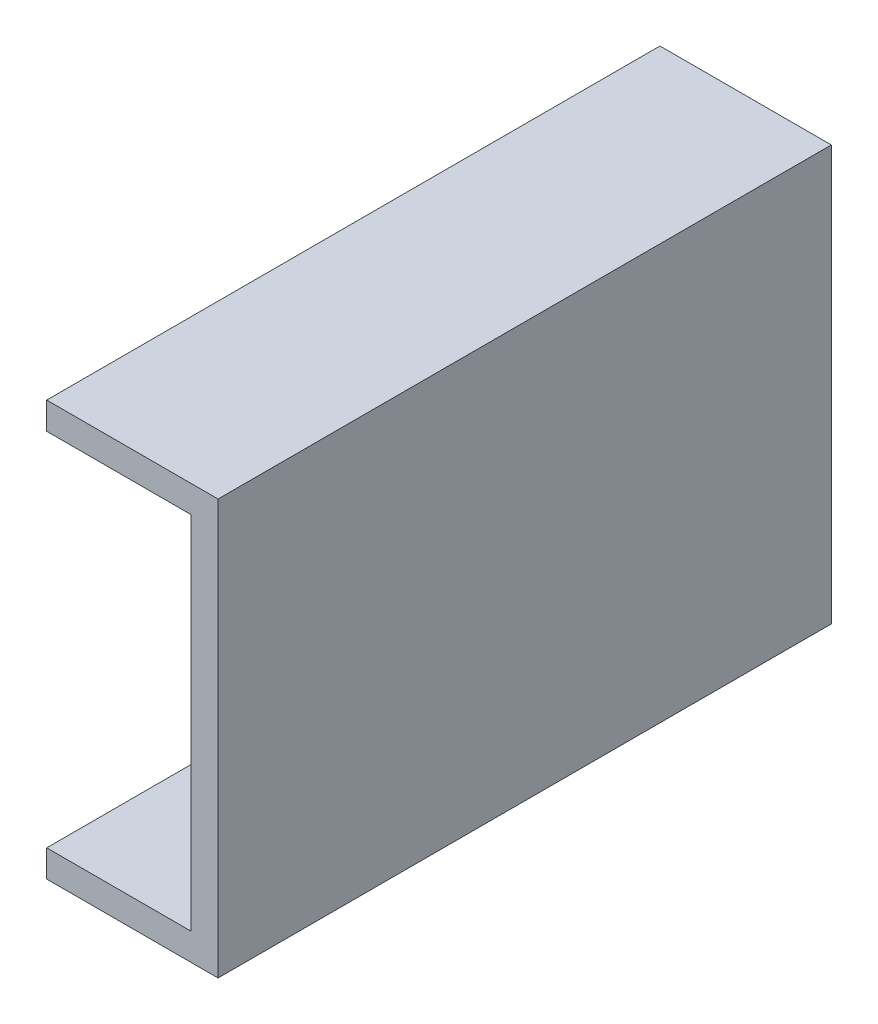
ISO-10303-21;
HEADER;
FILE_DESCRIPTION(('STEP AP214'),'2;1');
FILE_NAME('part.step','',(''),(''),'','','');
FILE_SCHEMA(('AUTOMOTIVE_DESIGN { 1 0 10303 214 1 1 1 1 }'));
ENDSEC;
DATA;
#1=APPLICATION_CONTEXT('core data for automotive mechanical design processes');
#2=APPLICATION_PROTOCOL_DEFINITION('international standard','automotive_design',2000,#1);
#3=PRODUCT_CONTEXT('',#1,'mechanical');
#4=PRODUCT('Part','Part','',(#3));
#5=PRODUCT_RELATED_PRODUCT_CATEGORY('part','',(#4));
#6=PRODUCT_DEFINITION_FORMATION('','',#4);
#7=PRODUCT_DEFINITION_CONTEXT('part definition',#1,'design');
#8=PRODUCT_DEFINITION('design','',#6,#7);
#9=PRODUCT_DEFINITION_SHAPE('','',#8);
#10=(LENGTH_UNIT() NAMED_UNIT(*) SI_UNIT(.MILLI.,.METRE.));
#11=(NAMED_UNIT(*) PLANE_ANGLE_UNIT() SI_UNIT($,.RADIAN.));
#12=(NAMED_UNIT(*) SI_UNIT($,.STERADIAN.) SOLID_ANGLE_UNIT());
#13=UNCERTAINTY_MEASURE_WITH_UNIT(LENGTH_MEASURE(1.E-05),#10,'distance_accuracy_value','');
#14=(GEOMETRIC_REPRESENTATION_CONTEXT(3) GLOBAL_UNCERTAINTY_ASSIGNED_CONTEXT((#13)) GLOBAL_UNIT_ASSIGNED_CONTEXT((#10,
#11,#12)) REPRESENTATION_CONTEXT('',''));
#15=CARTESIAN_POINT('',(0.,0.,0.));
#16=DIRECTION('',(0.,0.,1.));
#17=DIRECTION('',(1.,0.,0.));
#18=AXIS2_PLACEMENT_3D('',#15,#16,#17);
#19=CARTESIAN_POINT('',(0.,3.,68.));
#20=DIRECTION('',(1.,0.,0.));
#21=DIRECTION('',(0.,0.,-1.));
#22=AXIS2_PLACEMENT_3D('',#19,#20,#21);
#23=PLANE('',#22);
#24=DIRECTION('',(0.,-1.,0.));
#25=VECTOR('',#24,1.);
#26=CARTESIAN_POINT('',(0.,3.,0.));
#27=LINE('',#26,#25);
#28=CARTESIAN_POINT('',(0.,3.,0.));
#29=VERTEX_POINT('',#28);
#30=CARTESIAN_POINT('',(0.,0.,0.));
#31=VERTEX_POINT('',#30);
#32=EDGE_CURVE('E135',#29,#31,#27,.T.);
#33=ORIENTED_EDGE('',*,*,#32,.T.);
#34=DIRECTION('',(0.,0.,-1.));
#35=VECTOR('',#34,1.);
#36=CARTESIAN_POINT('',(0.,0.,68.));
#37=LINE('',#36,#35);
#38=CARTESIAN_POINT('',(0.,0.,68.));
#39=VERTEX_POINT('',#38);
#40=EDGE_CURVE('E11',#39,#31,#37,.T.);
#41=ORIENTED_EDGE('',*,*,#40,.F.);
#42=DIRECTION('',(0.,-1.,0.));
#43=VECTOR('',#42,1.);
#44=CARTESIAN_POINT('',(0.,3.,68.));
#45=LINE('',#44,#43);
#46=CARTESIAN_POINT('',(0.,3.,68.));
#47=VERTEX_POINT('',#46);
#48=EDGE_CURVE('E150',#47,#39,#45,.T.);
#49=ORIENTED_EDGE('',*,*,#48,.F.);
#50=DIRECTION('',(0.,0.,-1.));
#51=VECTOR('',#50,1.);
#52=CARTESIAN_POINT('',(0.,3.,68.));
#53=LINE('',#52,#51);
#54=EDGE_CURVE('E131',#47,#29,#53,.T.);
#55=ORIENTED_EDGE('',*,*,#54,.T.);
#56=EDGE_LOOP('',(#33,#41,#49,#55));
#57=FACE_BOUND('',#56,.T.);
#58=ADVANCED_FACE('F39',(#57),#23,.F.);
#59=CARTESIAN_POINT('',(0.,0.,68.));
#60=DIRECTION('',(0.,1.,0.));
#61=DIRECTION('',(0.,0.,1.));
#62=AXIS2_PLACEMENT_3D('',#59,#60,#61);
#63=PLANE('',#62);
#64=DIRECTION('',(1.,0.,0.));
#65=VECTOR('',#64,1.);
#66=CARTESIAN_POINT('',(0.,0.,0.));
#67=LINE('',#66,#65);
#68=CARTESIAN_POINT('',(16.,0.,0.));
#69=VERTEX_POINT('',#68);
#70=EDGE_CURVE('E138',#31,#69,#67,.T.);
#71=ORIENTED_EDGE('',*,*,#70,.T.);
#72=DIRECTION('',(0.,0.,-1.));
#73=VECTOR('',#72,1.);
#74=CARTESIAN_POINT('',(16.,0.,68.));
#75=LINE('',#74,#73);
#76=CARTESIAN_POINT('',(16.,0.,68.));
#77=VERTEX_POINT('',#76);
#78=EDGE_CURVE('E47',#77,#69,#75,.T.);
#79=ORIENTED_EDGE('',*,*,#78,.F.);
#80=DIRECTION('',(1.,0.,0.));
#81=VECTOR('',#80,1.);
#82=CARTESIAN_POINT('',(0.,0.,68.));
#83=LINE('',#82,#81);
#84=EDGE_CURVE('E98',#39,#77,#83,.T.);
#85=ORIENTED_EDGE('',*,*,#84,.F.);
#86=ORIENTED_EDGE('',*,*,#40,.T.);
#87=EDGE_LOOP('',(#71,#79,#85,#86));
#88=FACE_BOUND('',#87,.T.);
#89=ADVANCED_FACE('F218',(#88),#63,.F.);
#90=CARTESIAN_POINT('',(16.,0.,68.));
#91=DIRECTION('',(1.,0.,0.));
#92=DIRECTION('',(0.,1.,0.));
#93=AXIS2_PLACEMENT_3D('',#90,#91,#92);
#94=PLANE('',#93);
#95=DIRECTION('',(0.,-1.,0.));
#96=VECTOR('',#95,1.);
#97=CARTESIAN_POINT('',(16.,0.,0.));
#98=LINE('',#97,#96);
#99=CARTESIAN_POINT('',(16.,-40.,0.));
#100=VERTEX_POINT('',#99);
#101=EDGE_CURVE('E141',#69,#100,#98,.T.);
#102=ORIENTED_EDGE('',*,*,#101,.T.);
#103=DIRECTION('',(0.,0.,-1.));
#104=VECTOR('',#103,1.);
#105=CARTESIAN_POINT('',(16.,-40.,68.));
#106=LINE('',#105,#104);
#107=CARTESIAN_POINT('',(16.,-40.,68.));
#108=VERTEX_POINT('',#107);
#109=EDGE_CURVE('E157',#108,#100,#106,.T.);
#110=ORIENTED_EDGE('',*,*,#109,.F.);
#111=DIRECTION('',(0.,-1.,0.));
#112=VECTOR('',#111,1.);
#113=CARTESIAN_POINT('',(16.,0.,68.));
#114=LINE('',#113,#112);
#115=EDGE_CURVE('E165',#77,#108,#114,.T.);
#116=ORIENTED_EDGE('',*,*,#115,.F.);
#117=ORIENTED_EDGE('',*,*,#78,.T.);
#118=EDGE_LOOP('',(#102,#110,#116,#117));
#119=FACE_BOUND('',#118,.T.);
#120=ADVANCED_FACE('F163',(#119),#94,.F.);
#121=CARTESIAN_POINT('',(16.,-40.,68.));
#122=DIRECTION('',(0.,-1.,0.));
#123=DIRECTION('',(0.,0.,-1.));
#124=AXIS2_PLACEMENT_3D('',#121,#122,#123);
#125=PLANE('',#124);
#126=CARTESIAN_POINT('',(11.,-40.,57.250946932962));
#127=DIRECTION('',(0.,-1.,0.));
#128=DIRECTION('',(0.,0.,-1.));
#129=AXIS2_PLACEMENT_3D('',#126,#127,#128);
#130=CIRCLE('',#129,2.5);
#131=CARTESIAN_POINT('',(11.,-40.,54.750946932962));
#132=VERTEX_POINT('',#131);
#133=EDGE_CURVE('E188',#132,#132,#130,.T.);
#134=ORIENTED_EDGE('',*,*,#133,.T.);
#135=EDGE_LOOP('',(#134));
#136=FACE_BOUND('',#135,.T.);
#137=CARTESIAN_POINT('',(11.,-40.,7.25094693296198));
#138=DIRECTION('',(0.,-1.,0.));
#139=DIRECTION('',(0.,0.,-1.));
#140=AXIS2_PLACEMENT_3D('',#137,#138,#139);
#141=CIRCLE('',#140,2.5);
#142=CARTESIAN_POINT('',(11.,-40.,4.75094693296198));
#143=VERTEX_POINT('',#142);
#144=EDGE_CURVE('E139',#143,#143,#141,.T.);
#145=ORIENTED_EDGE('',*,*,#144,.T.);
#146=EDGE_LOOP('',(#145));
#147=FACE_BOUND('',#146,.T.);
#148=DIRECTION('',(-1.,0.,0.));
#149=VECTOR('',#148,1.);
#150=CARTESIAN_POINT('',(16.,-40.,0.));
#151=LINE('',#150,#149);
#152=CARTESIAN_POINT('',(0.,-40.,0.));
#153=VERTEX_POINT('',#152);
#154=EDGE_CURVE('E143',#100,#153,#151,.T.);
#155=ORIENTED_EDGE('',*,*,#154,.T.);
#156=DIRECTION('',(0.,0.,-1.));
#157=VECTOR('',#156,1.);
#158=CARTESIAN_POINT('',(0.,-40.,68.));
#159=LINE('',#158,#157);
#160=CARTESIAN_POINT('',(0.,-40.,68.));
#161=VERTEX_POINT('',#160);
#162=EDGE_CURVE('E154',#161,#153,#159,.T.);
#163=ORIENTED_EDGE('',*,*,#162,.F.);
#164=DIRECTION('',(-1.,0.,0.));
#165=VECTOR('',#164,1.);
#166=CARTESIAN_POINT('',(16.,-40.,68.));
#167=LINE('',#166,#165);
#168=EDGE_CURVE('E177',#108,#161,#167,.T.);
#169=ORIENTED_EDGE('',*,*,#168,.F.);
#170=ORIENTED_EDGE('',*,*,#109,.T.);
#171=EDGE_LOOP('',(#155,#163,#169,#170));
#172=FACE_BOUND('',#171,.T.);
#173=ADVANCED_FACE('F173',(#136,#147,#172),#125,.F.);
#174=CARTESIAN_POINT('',(0.,-40.,68.));
#175=DIRECTION('',(1.,0.,0.));
#176=DIRECTION('',(0.,1.,0.));
#177=AXIS2_PLACEMENT_3D('',#174,#175,#176);
#178=PLANE('',#177);
#179=DIRECTION('',(0.,-1.,0.));
#180=VECTOR('',#179,1.);
#181=CARTESIAN_POINT('',(0.,-40.,0.));
#182=LINE('',#181,#180);
#183=CARTESIAN_POINT('',(0.,-43.,0.));
#184=VERTEX_POINT('',#183);
#185=EDGE_CURVE('E145',#153,#184,#182,.T.);
#186=ORIENTED_EDGE('',*,*,#185,.T.);
#187=DIRECTION('',(0.,0.,-1.));
#188=VECTOR('',#187,1.);
#189=CARTESIAN_POINT('',(0.,-43.,68.));
#190=LINE('',#189,#188);
#191=CARTESIAN_POINT('',(0.,-43.,68.));
#192=VERTEX_POINT('',#191);
#193=EDGE_CURVE('E126',#192,#184,#190,.T.);
#194=ORIENTED_EDGE('',*,*,#193,.F.);
#195=DIRECTION('',(0.,-1.,0.));
#196=VECTOR('',#195,1.);
#197=CARTESIAN_POINT('',(0.,-40.,68.));
#198=LINE('',#197,#196);
#199=EDGE_CURVE('E117',#161,#192,#198,.T.);
#200=ORIENTED_EDGE('',*,*,#199,.F.);
#201=ORIENTED_EDGE('',*,*,#162,.T.);
#202=EDGE_LOOP('',(#186,#194,#200,#201));
#203=FACE_BOUND('',#202,.T.);
#204=ADVANCED_FACE('F176',(#203),#178,.F.);
#205=CARTESIAN_POINT('',(19.,-43.,68.));
#206=DIRECTION('',(0.,1.,0.));
#207=DIRECTION('',(0.,0.,1.));
#208=AXIS2_PLACEMENT_3D('',#205,#206,#207);
#209=PLANE('',#208);
#210=CARTESIAN_POINT('',(11.,-43.,57.250946932962));
#211=DIRECTION('',(0.,-1.,0.));
#212=DIRECTION('',(0.,0.,-1.));
#213=AXIS2_PLACEMENT_3D('',#210,#211,#212);
#214=CIRCLE('',#213,2.5);
#215=CARTESIAN_POINT('',(11.,-43.,54.750946932962));
#216=VERTEX_POINT('',#215);
#217=EDGE_CURVE('E191',#216,#216,#214,.T.);
#218=ORIENTED_EDGE('',*,*,#217,.F.);
#219=EDGE_LOOP('',(#218));
#220=FACE_BOUND('',#219,.T.);
#221=CARTESIAN_POINT('',(11.,-43.,7.25094693296198));
#222=DIRECTION('',(0.,-1.,0.));
#223=DIRECTION('',(0.,0.,-1.));
#224=AXIS2_PLACEMENT_3D('',#221,#222,#223);
#225=CIRCLE('',#224,2.5);
#226=CARTESIAN_POINT('',(11.,-43.,4.75094693296198));
#227=VERTEX_POINT('',#226);
#228=EDGE_CURVE('E185',#227,#227,#225,.T.);
#229=ORIENTED_EDGE('',*,*,#228,.F.);
#230=EDGE_LOOP('',(#229));
#231=FACE_BOUND('',#230,.T.);
#232=DIRECTION('',(1.,0.,0.));
#233=VECTOR('',#232,1.);
#234=CARTESIAN_POINT('',(19.,-43.,0.));
#235=LINE('',#234,#233);
#236=CARTESIAN_POINT('',(19.,-43.,0.));
#237=VERTEX_POINT('',#236);
#238=EDGE_CURVE('E125',#184,#237,#235,.T.);
#239=ORIENTED_EDGE('',*,*,#238,.T.);
#240=DIRECTION('',(0.,0.,-1.));
#241=VECTOR('',#240,1.);
#242=CARTESIAN_POINT('',(19.,-43.,68.));
#243=LINE('',#242,#241);
#244=CARTESIAN_POINT('',(19.,-43.,68.));
#245=VERTEX_POINT('',#244);
#246=EDGE_CURVE('E122',#245,#237,#243,.T.);
#247=ORIENTED_EDGE('',*,*,#246,.F.);
#248=DIRECTION('',(1.,0.,0.));
#249=VECTOR('',#248,1.);
#250=CARTESIAN_POINT('',(19.,-43.,68.));
#251=LINE('',#250,#249);
#252=EDGE_CURVE('E111',#192,#245,#251,.T.);
#253=ORIENTED_EDGE('',*,*,#252,.F.);
#254=ORIENTED_EDGE('',*,*,#193,.T.);
#255=EDGE_LOOP('',(#239,#247,#253,#254));
#256=FACE_BOUND('',#255,.T.);
#257=ADVANCED_FACE('F123',(#220,#231,#256),#209,.F.);
#258=CARTESIAN_POINT('',(19.,3.,68.));
#259=DIRECTION('',(-1.,0.,0.));
#260=DIRECTION('',(0.,0.,1.));
#261=AXIS2_PLACEMENT_3D('',#258,#259,#260);
#262=PLANE('',#261);
#263=DIRECTION('',(0.,1.,0.));
#264=VECTOR('',#263,1.);
#265=CARTESIAN_POINT('',(19.,3.,0.));
#266=LINE('',#265,#264);
#267=CARTESIAN_POINT('',(19.,3.,0.));
#268=VERTEX_POINT('',#267);
#269=EDGE_CURVE('E84',#237,#268,#266,.T.);
#270=ORIENTED_EDGE('',*,*,#269,.T.);
#271=DIRECTION('',(0.,0.,-1.));
#272=VECTOR('',#271,1.);
#273=CARTESIAN_POINT('',(19.,3.,68.));
#274=LINE('',#273,#272);
#275=CARTESIAN_POINT('',(19.,3.,68.));
#276=VERTEX_POINT('',#275);
#277=EDGE_CURVE('E127',#276,#268,#274,.T.);
#278=ORIENTED_EDGE('',*,*,#277,.F.);
#279=DIRECTION('',(0.,1.,0.));
#280=VECTOR('',#279,1.);
#281=CARTESIAN_POINT('',(19.,3.,68.));
#282=LINE('',#281,#280);
#283=EDGE_CURVE('E115',#245,#276,#282,.T.);
#284=ORIENTED_EDGE('',*,*,#283,.F.);
#285=ORIENTED_EDGE('',*,*,#246,.T.);
#286=EDGE_LOOP('',(#270,#278,#284,#285));
#287=FACE_BOUND('',#286,.T.);
#288=ADVANCED_FACE('F129',(#287),#262,.F.);
#289=CARTESIAN_POINT('',(0.,3.,68.));
#290=DIRECTION('',(0.,-1.,0.));
#291=DIRECTION('',(0.,0.,-1.));
#292=AXIS2_PLACEMENT_3D('',#289,#290,#291);
#293=PLANE('',#292);
#294=DIRECTION('',(-1.,0.,0.));
#295=VECTOR('',#294,1.);
#296=CARTESIAN_POINT('',(0.,3.,0.));
#297=LINE('',#296,#295);
#298=EDGE_CURVE('E90',#268,#29,#297,.T.);
#299=ORIENTED_EDGE('',*,*,#298,.T.);
#300=ORIENTED_EDGE('',*,*,#54,.F.);
#301=DIRECTION('',(-1.,0.,0.));
#302=VECTOR('',#301,1.);
#303=CARTESIAN_POINT('',(0.,3.,68.));
#304=LINE('',#303,#302);
#305=EDGE_CURVE('E55',#276,#47,#304,.T.);
#306=ORIENTED_EDGE('',*,*,#305,.F.);
#307=ORIENTED_EDGE('',*,*,#277,.T.);
#308=EDGE_LOOP('',(#299,#300,#306,#307));
#309=FACE_BOUND('',#308,.T.);
#310=ADVANCED_FACE('F227',(#309),#293,.F.);
#311=CARTESIAN_POINT('',(0.,0.,68.));
#312=DIRECTION('',(0.,0.,1.));
#313=DIRECTION('',(1.,0.,0.));
#314=AXIS2_PLACEMENT_3D('',#311,#312,#313);
#315=PLANE('',#314);
#316=ORIENTED_EDGE('',*,*,#48,.T.);
#317=ORIENTED_EDGE('',*,*,#84,.T.);
#318=ORIENTED_EDGE('',*,*,#115,.T.);
#319=ORIENTED_EDGE('',*,*,#168,.T.);
#320=ORIENTED_EDGE('',*,*,#199,.T.);
#321=ORIENTED_EDGE('',*,*,#252,.T.);
#322=ORIENTED_EDGE('',*,*,#283,.T.);
#323=ORIENTED_EDGE('',*,*,#305,.T.);
#324=EDGE_LOOP('',(#316,#317,#318,#319,#320,#321,#322,#323));
#325=FACE_BOUND('',#324,.T.);
#326=ADVANCED_FACE('F113',(#325),#315,.T.);
#327=CARTESIAN_POINT('',(0.,0.,0.));
#328=DIRECTION('',(0.,0.,1.));
#329=DIRECTION('',(1.,0.,0.));
#330=AXIS2_PLACEMENT_3D('',#327,#328,#329);
#331=PLANE('',#330);
#332=ORIENTED_EDGE('',*,*,#32,.F.);
#333=ORIENTED_EDGE('',*,*,#298,.F.);
#334=ORIENTED_EDGE('',*,*,#269,.F.);
#335=ORIENTED_EDGE('',*,*,#238,.F.);
#336=ORIENTED_EDGE('',*,*,#185,.F.);
#337=ORIENTED_EDGE('',*,*,#154,.F.);
#338=ORIENTED_EDGE('',*,*,#101,.F.);
#339=ORIENTED_EDGE('',*,*,#70,.F.);
#340=EDGE_LOOP('',(#332,#333,#334,#335,#336,#337,#338,#339));
#341=FACE_BOUND('',#340,.T.);
#342=ADVANCED_FACE('F169',(#341),#331,.F.);
#343=CARTESIAN_POINT('',(11.,-33.,7.25094693296198));
#344=DIRECTION('',(0.,-1.,0.));
#345=DIRECTION('',(0.,0.,-1.));
#346=AXIS2_PLACEMENT_3D('',#343,#344,#345);
#347=CYLINDRICAL_SURFACE('',#346,2.5);
#348=ORIENTED_EDGE('',*,*,#228,.T.);
#349=EDGE_LOOP('',(#348));
#350=FACE_BOUND('',#349,.T.);
#351=ORIENTED_EDGE('',*,*,#144,.F.);
#352=EDGE_LOOP('',(#351));
#353=FACE_BOUND('',#352,.T.);
#354=ADVANCED_FACE('F203',(#350,#353),#347,.F.);
#355=CARTESIAN_POINT('',(11.,-33.,57.250946932962));
#356=DIRECTION('',(0.,-1.,0.));
#357=DIRECTION('',(0.,0.,-1.));
#358=AXIS2_PLACEMENT_3D('',#355,#356,#357);
#359=CYLINDRICAL_SURFACE('',#358,2.5);
#360=ORIENTED_EDGE('',*,*,#217,.T.);
#361=EDGE_LOOP('',(#360));
#362=FACE_BOUND('',#361,.T.);
#363=ORIENTED_EDGE('',*,*,#133,.F.);
#364=EDGE_LOOP('',(#363));
#365=FACE_BOUND('',#364,.T.);
#366=ADVANCED_FACE('F195',(#362,#365),#359,.F.);
#367=CLOSED_SHELL('',(#58,#89,#120,#173,#204,#257,#288,#310,#326,#342,#354,#366));
#368=MANIFOLD_SOLID_BREP('B2',#367);
#369=ADVANCED_BREP_SHAPE_REPRESENTATION('',(#18,#368),#14);
#370=SHAPE_DEFINITION_REPRESENTATION(#9,#369);
ENDSEC;
END-ISO-10303-21;
